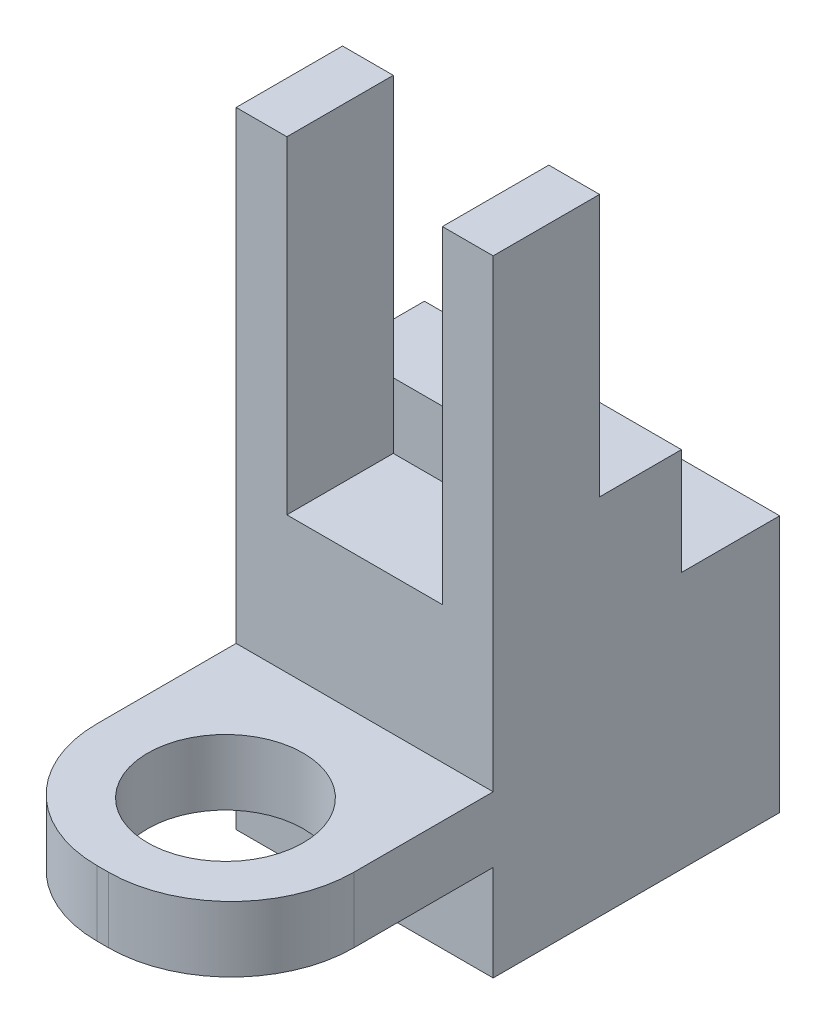
ISO-10303-21;
HEADER;
FILE_DESCRIPTION(('STEP AP214'),'2;1');
FILE_NAME('part.step','',(''),(''),'','','');
FILE_SCHEMA(('AUTOMOTIVE_DESIGN { 1 0 10303 214 1 1 1 1 }'));
ENDSEC;
DATA;
#1=APPLICATION_CONTEXT('core data for automotive mechanical design processes');
#2=APPLICATION_PROTOCOL_DEFINITION('international standard','automotive_design',2000,#1);
#3=PRODUCT_CONTEXT('',#1,'mechanical');
#4=PRODUCT('Part','Part','',(#3));
#5=PRODUCT_RELATED_PRODUCT_CATEGORY('part','',(#4));
#6=PRODUCT_DEFINITION_FORMATION('','',#4);
#7=PRODUCT_DEFINITION_CONTEXT('part definition',#1,'design');
#8=PRODUCT_DEFINITION('design','',#6,#7);
#9=PRODUCT_DEFINITION_SHAPE('','',#8);
#10=(LENGTH_UNIT() NAMED_UNIT(*) SI_UNIT(.MILLI.,.METRE.));
#11=(NAMED_UNIT(*) PLANE_ANGLE_UNIT() SI_UNIT($,.RADIAN.));
#12=(NAMED_UNIT(*) SI_UNIT($,.STERADIAN.) SOLID_ANGLE_UNIT());
#13=UNCERTAINTY_MEASURE_WITH_UNIT(LENGTH_MEASURE(1.E-05),#10,'distance_accuracy_value','');
#14=(GEOMETRIC_REPRESENTATION_CONTEXT(3) GLOBAL_UNCERTAINTY_ASSIGNED_CONTEXT((#13)) GLOBAL_UNIT_ASSIGNED_CONTEXT((#10,
#11,#12)) REPRESENTATION_CONTEXT('',''));
#15=CARTESIAN_POINT('',(0.,0.,0.));
#16=DIRECTION('',(0.,0.,1.));
#17=DIRECTION('',(1.,0.,0.));
#18=AXIS2_PLACEMENT_3D('',#15,#16,#17);
#19=CARTESIAN_POINT('',(0.,20.7,0.));
#20=DIRECTION('',(0.,-1.,0.));
#21=DIRECTION('',(0.,0.,-1.));
#22=AXIS2_PLACEMENT_3D('',#19,#20,#21);
#23=PLANE('',#22);
#24=DIRECTION('',(0.,0.,1.));
#25=VECTOR('',#24,1.);
#26=CARTESIAN_POINT('',(9.50000000000001,20.7,22.));
#27=LINE('',#26,#25);
#28=CARTESIAN_POINT('',(9.50000000000001,20.7,22.));
#29=VERTEX_POINT('',#28);
#30=CARTESIAN_POINT('',(9.50000000000001,20.7,35.));
#31=VERTEX_POINT('',#30);
#32=EDGE_CURVE('E230',#29,#31,#27,.T.);
#33=ORIENTED_EDGE('',*,*,#32,.F.);
#34=DIRECTION('',(-1.,0.,0.));
#35=VECTOR('',#34,1.);
#36=CARTESIAN_POINT('',(-15.7,20.7,22.));
#37=LINE('',#36,#35);
#38=CARTESIAN_POINT('',(-9.49999999999999,20.7,22.));
#39=VERTEX_POINT('',#38);
#40=EDGE_CURVE('E274',#29,#39,#37,.T.);
#41=ORIENTED_EDGE('',*,*,#40,.T.);
#42=DIRECTION('',(0.,0.,-1.));
#43=VECTOR('',#42,1.);
#44=CARTESIAN_POINT('',(-9.49999999999999,20.7,22.));
#45=LINE('',#44,#43);
#46=CARTESIAN_POINT('',(-9.49999999999999,20.7,35.));
#47=VERTEX_POINT('',#46);
#48=EDGE_CURVE('E240',#47,#39,#45,.T.);
#49=ORIENTED_EDGE('',*,*,#48,.F.);
#50=DIRECTION('',(-1.,0.,0.));
#51=VECTOR('',#50,1.);
#52=CARTESIAN_POINT('',(-9.49999999999999,20.7,35.));
#53=LINE('',#52,#51);
#54=EDGE_CURVE('E215',#31,#47,#53,.T.);
#55=ORIENTED_EDGE('',*,*,#54,.F.);
#56=EDGE_LOOP('',(#33,#41,#49,#55));
#57=FACE_BOUND('',#56,.T.);
#58=ADVANCED_FACE('F34',(#57),#23,.F.);
#59=CARTESIAN_POINT('',(15.7,28.7,22.));
#60=DIRECTION('',(0.,0.,-1.));
#61=DIRECTION('',(-1.,0.,0.));
#62=AXIS2_PLACEMENT_3D('',#59,#60,#61);
#63=PLANE('',#62);
#64=DIRECTION('',(0.,-1.,0.));
#65=VECTOR('',#64,1.);
#66=CARTESIAN_POINT('',(9.50000000000001,60.7,22.));
#67=LINE('',#66,#65);
#68=CARTESIAN_POINT('',(9.50000000000001,28.7,22.));
#69=VERTEX_POINT('',#68);
#70=EDGE_CURVE('E236',#69,#29,#67,.T.);
#71=ORIENTED_EDGE('',*,*,#70,.F.);
#72=DIRECTION('',(1.,0.,0.));
#73=VECTOR('',#72,1.);
#74=CARTESIAN_POINT('',(15.7,28.7,22.));
#75=LINE('',#74,#73);
#76=CARTESIAN_POINT('',(-9.49999999999999,28.7,22.));
#77=VERTEX_POINT('',#76);
#78=EDGE_CURVE('E260',#77,#69,#75,.T.);
#79=ORIENTED_EDGE('',*,*,#78,.F.);
#80=DIRECTION('',(0.,-1.,0.));
#81=VECTOR('',#80,1.);
#82=CARTESIAN_POINT('',(-9.49999999999999,60.7,22.));
#83=LINE('',#82,#81);
#84=EDGE_CURVE('E253',#77,#39,#83,.T.);
#85=ORIENTED_EDGE('',*,*,#84,.T.);
#86=ORIENTED_EDGE('',*,*,#40,.F.);
#87=EDGE_LOOP('',(#71,#79,#85,#86));
#88=FACE_BOUND('',#87,.T.);
#89=ADVANCED_FACE('F406',(#88),#63,.F.);
#90=CARTESIAN_POINT('',(-15.7,15.7,30.));
#91=DIRECTION('',(0.,-1.,0.));
#92=DIRECTION('',(0.,0.,-1.));
#93=AXIS2_PLACEMENT_3D('',#90,#91,#92);
#94=PLANE('',#93);
#95=DIRECTION('',(-1.,0.,0.));
#96=VECTOR('',#95,1.);
#97=CARTESIAN_POINT('',(-15.7,15.7,12.));
#98=LINE('',#97,#96);
#99=CARTESIAN_POINT('',(15.7,15.7,12.));
#100=VERTEX_POINT('',#99);
#101=CARTESIAN_POINT('',(-15.7,15.7,12.));
#102=VERTEX_POINT('',#101);
#103=EDGE_CURVE('E255',#100,#102,#98,.T.);
#104=ORIENTED_EDGE('',*,*,#103,.F.);
#105=DIRECTION('',(0.,0.,-1.));
#106=VECTOR('',#105,1.);
#107=CARTESIAN_POINT('',(15.7,15.7,30.));
#108=LINE('',#107,#106);
#109=CARTESIAN_POINT('',(15.7,15.7,0.));
#110=VERTEX_POINT('',#109);
#111=EDGE_CURVE('E371',#100,#110,#108,.T.);
#112=ORIENTED_EDGE('',*,*,#111,.T.);
#113=DIRECTION('',(-1.,0.,0.));
#114=VECTOR('',#113,1.);
#115=CARTESIAN_POINT('',(-15.7,15.7,0.));
#116=LINE('',#115,#114);
#117=CARTESIAN_POINT('',(-15.7,15.7,0.));
#118=VERTEX_POINT('',#117);
#119=EDGE_CURVE('E366',#110,#118,#116,.T.);
#120=ORIENTED_EDGE('',*,*,#119,.T.);
#121=DIRECTION('',(0.,0.,-1.));
#122=VECTOR('',#121,1.);
#123=CARTESIAN_POINT('',(-15.7,15.7,30.));
#124=LINE('',#123,#122);
#125=EDGE_CURVE('E369',#102,#118,#124,.T.);
#126=ORIENTED_EDGE('',*,*,#125,.F.);
#127=EDGE_LOOP('',(#104,#112,#120,#126));
#128=FACE_BOUND('',#127,.T.);
#129=ADVANCED_FACE('F385',(#128),#94,.F.);
#130=CARTESIAN_POINT('',(0.,0.,35.));
#131=DIRECTION('',(0.,0.,-1.));
#132=DIRECTION('',(-1.,0.,0.));
#133=AXIS2_PLACEMENT_3D('',#130,#131,#132);
#134=PLANE('',#133);
#135=DIRECTION('',(-1.,0.,0.));
#136=VECTOR('',#135,1.);
#137=CARTESIAN_POINT('',(-15.7,4.,35.));
#138=LINE('',#137,#136);
#139=CARTESIAN_POINT('',(15.7,4.,35.));
#140=VERTEX_POINT('',#139);
#141=CARTESIAN_POINT('',(-15.7,4.,35.));
#142=VERTEX_POINT('',#141);
#143=EDGE_CURVE('E57',#140,#142,#138,.T.);
#144=ORIENTED_EDGE('',*,*,#143,.F.);
#145=DIRECTION('',(0.,1.,0.));
#146=VECTOR('',#145,1.);
#147=CARTESIAN_POINT('',(15.7,15.7,35.));
#148=LINE('',#147,#146);
#149=CARTESIAN_POINT('',(15.7,60.7,35.));
#150=VERTEX_POINT('',#149);
#151=EDGE_CURVE('E188',#140,#150,#148,.T.);
#152=ORIENTED_EDGE('',*,*,#151,.T.);
#153=DIRECTION('',(-1.,0.,0.));
#154=VECTOR('',#153,1.);
#155=CARTESIAN_POINT('',(9.50000000000001,60.7,35.));
#156=LINE('',#155,#154);
#157=CARTESIAN_POINT('',(9.50000000000001,60.7,35.));
#158=VERTEX_POINT('',#157);
#159=EDGE_CURVE('E193',#150,#158,#156,.T.);
#160=ORIENTED_EDGE('',*,*,#159,.T.);
#161=DIRECTION('',(0.,-1.,0.));
#162=VECTOR('',#161,1.);
#163=CARTESIAN_POINT('',(9.50000000000001,20.7,35.));
#164=LINE('',#163,#162);
#165=EDGE_CURVE('E212',#158,#31,#164,.T.);
#166=ORIENTED_EDGE('',*,*,#165,.T.);
#167=ORIENTED_EDGE('',*,*,#54,.T.);
#168=DIRECTION('',(0.,1.,0.));
#169=VECTOR('',#168,1.);
#170=CARTESIAN_POINT('',(-9.49999999999999,60.7,35.));
#171=LINE('',#170,#169);
#172=CARTESIAN_POINT('',(-9.49999999999999,60.7,35.));
#173=VERTEX_POINT('',#172);
#174=EDGE_CURVE('E224',#47,#173,#171,.T.);
#175=ORIENTED_EDGE('',*,*,#174,.T.);
#176=DIRECTION('',(-1.,0.,0.));
#177=VECTOR('',#176,1.);
#178=CARTESIAN_POINT('',(-15.7,60.7,35.));
#179=LINE('',#178,#177);
#180=CARTESIAN_POINT('',(-15.7,60.7,35.));
#181=VERTEX_POINT('',#180);
#182=EDGE_CURVE('E227',#173,#181,#179,.T.);
#183=ORIENTED_EDGE('',*,*,#182,.T.);
#184=DIRECTION('',(0.,-1.,0.));
#185=VECTOR('',#184,1.);
#186=CARTESIAN_POINT('',(-15.7,-15.7,35.));
#187=LINE('',#186,#185);
#188=EDGE_CURVE('E320',#181,#142,#187,.T.);
#189=ORIENTED_EDGE('',*,*,#188,.T.);
#190=EDGE_LOOP('',(#144,#152,#160,#166,#167,#175,#183,#189));
#191=FACE_BOUND('',#190,.T.);
#192=ADVANCED_FACE('F190',(#191),#134,.F.);
#193=DIRECTION('',(1.,0.,0.));
#194=VECTOR('',#193,1.);
#195=CARTESIAN_POINT('',(15.7,-4.,35.));
#196=LINE('',#195,#194);
#197=CARTESIAN_POINT('',(-15.7,-4.,35.));
#198=VERTEX_POINT('',#197);
#199=CARTESIAN_POINT('',(15.7,-4.,35.));
#200=VERTEX_POINT('',#199);
#201=EDGE_CURVE('E298',#198,#200,#196,.T.);
#202=ORIENTED_EDGE('',*,*,#201,.F.);
#203=CARTESIAN_POINT('',(-15.7,-15.7,35.));
#204=VERTEX_POINT('',#203);
#205=EDGE_CURVE('E319',#198,#204,#187,.T.);
#206=ORIENTED_EDGE('',*,*,#205,.T.);
#207=DIRECTION('',(1.,0.,0.));
#208=VECTOR('',#207,1.);
#209=CARTESIAN_POINT('',(15.7,-15.7,35.));
#210=LINE('',#209,#208);
#211=CARTESIAN_POINT('',(15.7,-15.7,35.));
#212=VERTEX_POINT('',#211);
#213=EDGE_CURVE('E198',#204,#212,#210,.T.);
#214=ORIENTED_EDGE('',*,*,#213,.T.);
#215=EDGE_CURVE('E197',#212,#200,#148,.T.);
#216=ORIENTED_EDGE('',*,*,#215,.T.);
#217=EDGE_LOOP('',(#202,#206,#214,#216));
#218=FACE_BOUND('',#217,.T.);
#219=ADVANCED_FACE('F434',(#218),#134,.F.);
#220=CARTESIAN_POINT('',(0.,0.,0.));
#221=DIRECTION('',(0.,0.,1.));
#222=DIRECTION('',(1.,0.,0.));
#223=AXIS2_PLACEMENT_3D('',#220,#221,#222);
#224=PLANE('',#223);
#225=DIRECTION('',(0.,-1.,0.));
#226=VECTOR('',#225,1.);
#227=CARTESIAN_POINT('',(-15.7,15.7,0.));
#228=LINE('',#227,#226);
#229=CARTESIAN_POINT('',(-15.7,-15.7,0.));
#230=VERTEX_POINT('',#229);
#231=EDGE_CURVE('E358',#118,#230,#228,.T.);
#232=ORIENTED_EDGE('',*,*,#231,.F.);
#233=ORIENTED_EDGE('',*,*,#119,.F.);
#234=DIRECTION('',(0.,1.,0.));
#235=VECTOR('',#234,1.);
#236=CARTESIAN_POINT('',(15.7,15.7,0.));
#237=LINE('',#236,#235);
#238=CARTESIAN_POINT('',(15.7,-15.7,0.));
#239=VERTEX_POINT('',#238);
#240=EDGE_CURVE('E363',#239,#110,#237,.T.);
#241=ORIENTED_EDGE('',*,*,#240,.F.);
#242=DIRECTION('',(1.,0.,0.));
#243=VECTOR('',#242,1.);
#244=CARTESIAN_POINT('',(-15.7,-15.7,0.));
#245=LINE('',#244,#243);
#246=EDGE_CURVE('E361',#230,#239,#245,.T.);
#247=ORIENTED_EDGE('',*,*,#246,.F.);
#248=EDGE_LOOP('',(#232,#233,#241,#247));
#249=FACE_BOUND('',#248,.T.);
#250=DIRECTION('',(-1.,0.,0.));
#251=VECTOR('',#250,1.);
#252=CARTESIAN_POINT('',(-12.7,12.7,0.));
#253=LINE('',#252,#251);
#254=CARTESIAN_POINT('',(12.7,12.7,0.));
#255=VERTEX_POINT('',#254);
#256=CARTESIAN_POINT('',(-12.7,12.7,0.));
#257=VERTEX_POINT('',#256);
#258=EDGE_CURVE('E324',#255,#257,#253,.T.);
#259=ORIENTED_EDGE('',*,*,#258,.T.);
#260=DIRECTION('',(0.,-1.,0.));
#261=VECTOR('',#260,1.);
#262=CARTESIAN_POINT('',(-12.7,12.7,0.));
#263=LINE('',#262,#261);
#264=CARTESIAN_POINT('',(-12.7,-12.7,0.));
#265=VERTEX_POINT('',#264);
#266=EDGE_CURVE('E341',#257,#265,#263,.T.);
#267=ORIENTED_EDGE('',*,*,#266,.T.);
#268=DIRECTION('',(1.,0.,0.));
#269=VECTOR('',#268,1.);
#270=CARTESIAN_POINT('',(-12.7,-12.7,0.));
#271=LINE('',#270,#269);
#272=CARTESIAN_POINT('',(12.7,-12.7,0.));
#273=VERTEX_POINT('',#272);
#274=EDGE_CURVE('E344',#265,#273,#271,.T.);
#275=ORIENTED_EDGE('',*,*,#274,.T.);
#276=DIRECTION('',(0.,1.,0.));
#277=VECTOR('',#276,1.);
#278=CARTESIAN_POINT('',(12.7,12.7,0.));
#279=LINE('',#278,#277);
#280=EDGE_CURVE('E329',#273,#255,#279,.T.);
#281=ORIENTED_EDGE('',*,*,#280,.T.);
#282=EDGE_LOOP('',(#259,#267,#275,#281));
#283=FACE_BOUND('',#282,.T.);
#284=ADVANCED_FACE('F380',(#249,#283),#224,.F.);
#285=CARTESIAN_POINT('',(-15.7,15.7,30.));
#286=DIRECTION('',(1.,0.,0.));
#287=DIRECTION('',(0.,1.,0.));
#288=AXIS2_PLACEMENT_3D('',#285,#286,#287);
#289=PLANE('',#288);
#290=ORIENTED_EDGE('',*,*,#188,.F.);
#291=DIRECTION('',(0.,0.,1.));
#292=VECTOR('',#291,1.);
#293=CARTESIAN_POINT('',(-15.7,60.7,32.));
#294=LINE('',#293,#292);
#295=CARTESIAN_POINT('',(-15.7,60.7,22.));
#296=VERTEX_POINT('',#295);
#297=EDGE_CURVE('E241',#296,#181,#294,.T.);
#298=ORIENTED_EDGE('',*,*,#297,.F.);
#299=DIRECTION('',(0.,-1.,0.));
#300=VECTOR('',#299,1.);
#301=CARTESIAN_POINT('',(-15.7,60.7,22.));
#302=LINE('',#301,#300);
#303=CARTESIAN_POINT('',(-15.7,28.7,22.));
#304=VERTEX_POINT('',#303);
#305=EDGE_CURVE('E248',#296,#304,#302,.T.);
#306=ORIENTED_EDGE('',*,*,#305,.T.);
#307=DIRECTION('',(0.,0.,1.));
#308=VECTOR('',#307,1.);
#309=CARTESIAN_POINT('',(-15.7,28.7,22.));
#310=LINE('',#309,#308);
#311=CARTESIAN_POINT('',(-15.7,28.7,12.));
#312=VERTEX_POINT('',#311);
#313=EDGE_CURVE('E265',#312,#304,#310,.T.);
#314=ORIENTED_EDGE('',*,*,#313,.F.);
#315=DIRECTION('',(0.,-1.,0.));
#316=VECTOR('',#315,1.);
#317=CARTESIAN_POINT('',(-15.7,28.7,12.));
#318=LINE('',#317,#316);
#319=EDGE_CURVE('E268',#312,#102,#318,.T.);
#320=ORIENTED_EDGE('',*,*,#319,.T.);
#321=ORIENTED_EDGE('',*,*,#125,.T.);
#322=ORIENTED_EDGE('',*,*,#231,.T.);
#323=DIRECTION('',(0.,0.,-1.));
#324=VECTOR('',#323,1.);
#325=CARTESIAN_POINT('',(-15.7,-15.7,30.));
#326=LINE('',#325,#324);
#327=EDGE_CURVE('E11',#204,#230,#326,.T.);
#328=ORIENTED_EDGE('',*,*,#327,.F.);
#329=ORIENTED_EDGE('',*,*,#205,.F.);
#330=DIRECTION('',(0.,0.,-1.));
#331=VECTOR('',#330,1.);
#332=CARTESIAN_POINT('',(-15.7,-4.,40.));
#333=LINE('',#332,#331);
#334=CARTESIAN_POINT('',(-15.7,-4.,52.));
#335=VERTEX_POINT('',#334);
#336=EDGE_CURVE('E316',#335,#198,#333,.T.);
#337=ORIENTED_EDGE('',*,*,#336,.F.);
#338=DIRECTION('',(0.,-1.,0.));
#339=VECTOR('',#338,1.);
#340=CARTESIAN_POINT('',(-15.7,4.,52.));
#341=LINE('',#340,#339);
#342=CARTESIAN_POINT('',(-15.7,4.,52.));
#343=VERTEX_POINT('',#342);
#344=EDGE_CURVE('E295',#343,#335,#341,.T.);
#345=ORIENTED_EDGE('',*,*,#344,.F.);
#346=DIRECTION('',(0.,0.,-1.));
#347=VECTOR('',#346,1.);
#348=CARTESIAN_POINT('',(-15.7,4.,40.));
#349=LINE('',#348,#347);
#350=EDGE_CURVE('E308',#343,#142,#349,.T.);
#351=ORIENTED_EDGE('',*,*,#350,.T.);
#352=EDGE_LOOP('',(#290,#298,#306,#314,#320,#321,#322,#328,#329,#337,#345,#351));
#353=FACE_BOUND('',#352,.T.);
#354=ADVANCED_FACE('F36',(#353),#289,.F.);
#355=CARTESIAN_POINT('',(-15.7,-15.7,30.));
#356=DIRECTION('',(0.,1.,0.));
#357=DIRECTION('',(0.,0.,1.));
#358=AXIS2_PLACEMENT_3D('',#355,#356,#357);
#359=PLANE('',#358);
#360=ORIENTED_EDGE('',*,*,#246,.T.);
#361=DIRECTION('',(0.,0.,-1.));
#362=VECTOR('',#361,1.);
#363=CARTESIAN_POINT('',(15.7,-15.7,30.));
#364=LINE('',#363,#362);
#365=EDGE_CURVE('E42',#212,#239,#364,.T.);
#366=ORIENTED_EDGE('',*,*,#365,.F.);
#367=ORIENTED_EDGE('',*,*,#213,.F.);
#368=ORIENTED_EDGE('',*,*,#327,.T.);
#369=EDGE_LOOP('',(#360,#366,#367,#368));
#370=FACE_BOUND('',#369,.T.);
#371=ADVANCED_FACE('F436',(#370),#359,.F.);
#372=CARTESIAN_POINT('',(15.7,15.7,30.));
#373=DIRECTION('',(-1.,0.,0.));
#374=DIRECTION('',(0.,-1.,0.));
#375=AXIS2_PLACEMENT_3D('',#372,#373,#374);
#376=PLANE('',#375);
#377=ORIENTED_EDGE('',*,*,#111,.F.);
#378=DIRECTION('',(0.,-1.,0.));
#379=VECTOR('',#378,1.);
#380=CARTESIAN_POINT('',(15.7,28.7,12.));
#381=LINE('',#380,#379);
#382=CARTESIAN_POINT('',(15.7,28.7,12.));
#383=VERTEX_POINT('',#382);
#384=EDGE_CURVE('E272',#383,#100,#381,.T.);
#385=ORIENTED_EDGE('',*,*,#384,.F.);
#386=DIRECTION('',(0.,0.,-1.));
#387=VECTOR('',#386,1.);
#388=CARTESIAN_POINT('',(15.7,28.7,12.));
#389=LINE('',#388,#387);
#390=CARTESIAN_POINT('',(15.7,28.7,22.));
#391=VERTEX_POINT('',#390);
#392=EDGE_CURVE('E259',#391,#383,#389,.T.);
#393=ORIENTED_EDGE('',*,*,#392,.F.);
#394=DIRECTION('',(0.,-1.,0.));
#395=VECTOR('',#394,1.);
#396=CARTESIAN_POINT('',(15.7,60.7,22.));
#397=LINE('',#396,#395);
#398=CARTESIAN_POINT('',(15.7,60.7,22.));
#399=VERTEX_POINT('',#398);
#400=EDGE_CURVE('E205',#399,#391,#397,.T.);
#401=ORIENTED_EDGE('',*,*,#400,.F.);
#402=DIRECTION('',(0.,0.,-1.));
#403=VECTOR('',#402,1.);
#404=CARTESIAN_POINT('',(15.7,60.7,32.));
#405=LINE('',#404,#403);
#406=EDGE_CURVE('E201',#150,#399,#405,.T.);
#407=ORIENTED_EDGE('',*,*,#406,.F.);
#408=ORIENTED_EDGE('',*,*,#151,.F.);
#409=DIRECTION('',(0.,0.,-1.));
#410=VECTOR('',#409,1.);
#411=CARTESIAN_POINT('',(15.7,4.,40.));
#412=LINE('',#411,#410);
#413=CARTESIAN_POINT('',(15.7,4.,52.));
#414=VERTEX_POINT('',#413);
#415=EDGE_CURVE('E311',#414,#140,#412,.T.);
#416=ORIENTED_EDGE('',*,*,#415,.F.);
#417=DIRECTION('',(0.,-1.,0.));
#418=VECTOR('',#417,1.);
#419=CARTESIAN_POINT('',(15.7,4.,52.));
#420=LINE('',#419,#418);
#421=CARTESIAN_POINT('',(15.7,-4.,52.));
#422=VERTEX_POINT('',#421);
#423=EDGE_CURVE('E287',#414,#422,#420,.T.);
#424=ORIENTED_EDGE('',*,*,#423,.T.);
#425=DIRECTION('',(0.,0.,-1.));
#426=VECTOR('',#425,1.);
#427=CARTESIAN_POINT('',(15.7,-4.,40.));
#428=LINE('',#427,#426);
#429=EDGE_CURVE('E313',#422,#200,#428,.T.);
#430=ORIENTED_EDGE('',*,*,#429,.T.);
#431=ORIENTED_EDGE('',*,*,#215,.F.);
#432=ORIENTED_EDGE('',*,*,#365,.T.);
#433=ORIENTED_EDGE('',*,*,#240,.T.);
#434=EDGE_LOOP('',(#377,#385,#393,#401,#407,#408,#416,#424,#430,#431,#432,#433));
#435=FACE_BOUND('',#434,.T.);
#436=ADVANCED_FACE('F203',(#435),#376,.F.);
#437=CARTESIAN_POINT('',(-12.7,12.7,30.));
#438=DIRECTION('',(0.,-1.,0.));
#439=DIRECTION('',(0.,0.,-1.));
#440=AXIS2_PLACEMENT_3D('',#437,#438,#439);
#441=PLANE('',#440);
#442=ORIENTED_EDGE('',*,*,#258,.F.);
#443=DIRECTION('',(0.,0.,-1.));
#444=VECTOR('',#443,1.);
#445=CARTESIAN_POINT('',(12.7,12.7,30.));
#446=LINE('',#445,#444);
#447=CARTESIAN_POINT('',(12.7,12.7,30.));
#448=VERTEX_POINT('',#447);
#449=EDGE_CURVE('E338',#448,#255,#446,.T.);
#450=ORIENTED_EDGE('',*,*,#449,.F.);
#451=DIRECTION('',(-1.,0.,0.));
#452=VECTOR('',#451,1.);
#453=CARTESIAN_POINT('',(-12.7,12.7,30.));
#454=LINE('',#453,#452);
#455=CARTESIAN_POINT('',(-12.7,12.7,30.));
#456=VERTEX_POINT('',#455);
#457=EDGE_CURVE('E325',#448,#456,#454,.T.);
#458=ORIENTED_EDGE('',*,*,#457,.T.);
#459=DIRECTION('',(0.,0.,-1.));
#460=VECTOR('',#459,1.);
#461=CARTESIAN_POINT('',(-12.7,12.7,30.));
#462=LINE('',#461,#460);
#463=EDGE_CURVE('E355',#456,#257,#462,.T.);
#464=ORIENTED_EDGE('',*,*,#463,.T.);
#465=EDGE_LOOP('',(#442,#450,#458,#464));
#466=FACE_BOUND('',#465,.T.);
#467=ADVANCED_FACE('F442',(#466),#441,.T.);
#468=CARTESIAN_POINT('',(-12.7,12.7,30.));
#469=DIRECTION('',(1.,0.,0.));
#470=DIRECTION('',(0.,1.,0.));
#471=AXIS2_PLACEMENT_3D('',#468,#469,#470);
#472=PLANE('',#471);
#473=ORIENTED_EDGE('',*,*,#266,.F.);
#474=ORIENTED_EDGE('',*,*,#463,.F.);
#475=DIRECTION('',(0.,-1.,0.));
#476=VECTOR('',#475,1.);
#477=CARTESIAN_POINT('',(-12.7,12.7,30.));
#478=LINE('',#477,#476);
#479=CARTESIAN_POINT('',(-12.7,-12.7,30.));
#480=VERTEX_POINT('',#479);
#481=EDGE_CURVE('E328',#456,#480,#478,.T.);
#482=ORIENTED_EDGE('',*,*,#481,.T.);
#483=DIRECTION('',(0.,0.,-1.));
#484=VECTOR('',#483,1.);
#485=CARTESIAN_POINT('',(-12.7,-12.7,30.));
#486=LINE('',#485,#484);
#487=EDGE_CURVE('E353',#480,#265,#486,.T.);
#488=ORIENTED_EDGE('',*,*,#487,.T.);
#489=EDGE_LOOP('',(#473,#474,#482,#488));
#490=FACE_BOUND('',#489,.T.);
#491=ADVANCED_FACE('F481',(#490),#472,.T.);
#492=CARTESIAN_POINT('',(-12.7,-12.7,30.));
#493=DIRECTION('',(0.,1.,0.));
#494=DIRECTION('',(0.,0.,1.));
#495=AXIS2_PLACEMENT_3D('',#492,#493,#494);
#496=PLANE('',#495);
#497=ORIENTED_EDGE('',*,*,#274,.F.);
#498=ORIENTED_EDGE('',*,*,#487,.F.);
#499=DIRECTION('',(1.,0.,0.));
#500=VECTOR('',#499,1.);
#501=CARTESIAN_POINT('',(-12.7,-12.7,30.));
#502=LINE('',#501,#500);
#503=CARTESIAN_POINT('',(12.7,-12.7,30.));
#504=VERTEX_POINT('',#503);
#505=EDGE_CURVE('E332',#480,#504,#502,.T.);
#506=ORIENTED_EDGE('',*,*,#505,.T.);
#507=DIRECTION('',(0.,0.,-1.));
#508=VECTOR('',#507,1.);
#509=CARTESIAN_POINT('',(12.7,-12.7,30.));
#510=LINE('',#509,#508);
#511=EDGE_CURVE('E351',#504,#273,#510,.T.);
#512=ORIENTED_EDGE('',*,*,#511,.T.);
#513=EDGE_LOOP('',(#497,#498,#506,#512));
#514=FACE_BOUND('',#513,.T.);
#515=ADVANCED_FACE('F477',(#514),#496,.T.);
#516=CARTESIAN_POINT('',(12.7,12.7,30.));
#517=DIRECTION('',(-1.,0.,0.));
#518=DIRECTION('',(0.,-1.,0.));
#519=AXIS2_PLACEMENT_3D('',#516,#517,#518);
#520=PLANE('',#519);
#521=ORIENTED_EDGE('',*,*,#280,.F.);
#522=ORIENTED_EDGE('',*,*,#511,.F.);
#523=DIRECTION('',(0.,1.,0.));
#524=VECTOR('',#523,1.);
#525=CARTESIAN_POINT('',(12.7,12.7,30.));
#526=LINE('',#525,#524);
#527=EDGE_CURVE('E335',#504,#448,#526,.T.);
#528=ORIENTED_EDGE('',*,*,#527,.T.);
#529=ORIENTED_EDGE('',*,*,#449,.T.);
#530=EDGE_LOOP('',(#521,#522,#528,#529));
#531=FACE_BOUND('',#530,.T.);
#532=ADVANCED_FACE('F473',(#531),#520,.T.);
#533=CARTESIAN_POINT('',(0.,0.,30.));
#534=DIRECTION('',(0.,0.,-1.));
#535=DIRECTION('',(-1.,0.,0.));
#536=AXIS2_PLACEMENT_3D('',#533,#534,#535);
#537=PLANE('',#536);
#538=ORIENTED_EDGE('',*,*,#481,.F.);
#539=ORIENTED_EDGE('',*,*,#457,.F.);
#540=ORIENTED_EDGE('',*,*,#527,.F.);
#541=ORIENTED_EDGE('',*,*,#505,.F.);
#542=EDGE_LOOP('',(#538,#539,#540,#541));
#543=FACE_BOUND('',#542,.T.);
#544=ADVANCED_FACE('F467',(#543),#537,.T.);
#545=CARTESIAN_POINT('',(15.7,-4.,40.));
#546=DIRECTION('',(0.,1.,0.));
#547=DIRECTION('',(-1.,0.,0.));
#548=AXIS2_PLACEMENT_3D('',#545,#546,#547);
#549=PLANE('',#548);
#550=CARTESIAN_POINT('',(0.,-4.00000000000001,52.));
#551=DIRECTION('',(0.,1.,0.));
#552=DIRECTION('',(-1.,0.,0.));
#553=AXIS2_PLACEMENT_3D('',#550,#551,#552);
#554=CIRCLE('',#553,9.5);
#555=CARTESIAN_POINT('',(-9.5,-4.00000000000001,52.));
#556=VERTEX_POINT('',#555);
#557=EDGE_CURVE('E213',#556,#556,#554,.T.);
#558=ORIENTED_EDGE('',*,*,#557,.T.);
#559=EDGE_LOOP('',(#558));
#560=FACE_BOUND('',#559,.T.);
#561=ORIENTED_EDGE('',*,*,#201,.T.);
#562=ORIENTED_EDGE('',*,*,#429,.F.);
#563=CARTESIAN_POINT('',(0.699999999999999,-4.,52.));
#564=DIRECTION('',(0.,-1.,0.));
#565=DIRECTION('',(-1.,0.,0.));
#566=AXIS2_PLACEMENT_3D('',#563,#564,#565);
#567=CIRCLE('',#566,15.);
#568=CARTESIAN_POINT('',(0.699999999999999,-4.,67.));
#569=VERTEX_POINT('',#568);
#570=EDGE_CURVE('E276',#422,#569,#567,.T.);
#571=ORIENTED_EDGE('',*,*,#570,.T.);
#572=DIRECTION('',(-1.,0.,0.));
#573=VECTOR('',#572,1.);
#574=CARTESIAN_POINT('',(-0.699999999999992,-4.,67.));
#575=LINE('',#574,#573);
#576=CARTESIAN_POINT('',(-0.699999999999993,-4.,67.));
#577=VERTEX_POINT('',#576);
#578=EDGE_CURVE('E290',#569,#577,#575,.T.);
#579=ORIENTED_EDGE('',*,*,#578,.T.);
#580=CARTESIAN_POINT('',(-0.699999999999992,-4.,52.));
#581=DIRECTION('',(0.,-1.,0.));
#582=DIRECTION('',(-1.,0.,0.));
#583=AXIS2_PLACEMENT_3D('',#580,#581,#582);
#584=CIRCLE('',#583,15.);
#585=EDGE_CURVE('E281',#577,#335,#584,.T.);
#586=ORIENTED_EDGE('',*,*,#585,.T.);
#587=ORIENTED_EDGE('',*,*,#336,.T.);
#588=EDGE_LOOP('',(#561,#562,#571,#579,#586,#587));
#589=FACE_BOUND('',#588,.T.);
#590=ADVANCED_FACE('F431',(#560,#589),#549,.F.);
#591=CARTESIAN_POINT('',(-15.7,4.,40.));
#592=DIRECTION('',(0.,-1.,0.));
#593=DIRECTION('',(0.,0.,-1.));
#594=AXIS2_PLACEMENT_3D('',#591,#592,#593);
#595=PLANE('',#594);
#596=CARTESIAN_POINT('',(0.,4.,52.));
#597=DIRECTION('',(0.,-1.,0.));
#598=DIRECTION('',(0.,0.,-1.));
#599=AXIS2_PLACEMENT_3D('',#596,#597,#598);
#600=CIRCLE('',#599,9.5);
#601=CARTESIAN_POINT('',(0.,4.,42.5));
#602=VERTEX_POINT('',#601);
#603=EDGE_CURVE('E218',#602,#602,#600,.T.);
#604=ORIENTED_EDGE('',*,*,#603,.T.);
#605=EDGE_LOOP('',(#604));
#606=FACE_BOUND('',#605,.T.);
#607=ORIENTED_EDGE('',*,*,#143,.T.);
#608=ORIENTED_EDGE('',*,*,#350,.F.);
#609=CARTESIAN_POINT('',(-0.699999999999993,4.,52.));
#610=DIRECTION('',(0.,-1.,0.));
#611=DIRECTION('',(-1.,0.,0.));
#612=AXIS2_PLACEMENT_3D('',#609,#610,#611);
#613=CIRCLE('',#612,15.);
#614=CARTESIAN_POINT('',(-0.699999999999994,4.,67.));
#615=VERTEX_POINT('',#614);
#616=EDGE_CURVE('E284',#615,#343,#613,.T.);
#617=ORIENTED_EDGE('',*,*,#616,.F.);
#618=DIRECTION('',(-1.,0.,0.));
#619=VECTOR('',#618,1.);
#620=CARTESIAN_POINT('',(-0.699999999999993,4.,67.));
#621=LINE('',#620,#619);
#622=CARTESIAN_POINT('',(0.699999999999998,4.,67.));
#623=VERTEX_POINT('',#622);
#624=EDGE_CURVE('E280',#623,#615,#621,.T.);
#625=ORIENTED_EDGE('',*,*,#624,.F.);
#626=CARTESIAN_POINT('',(0.699999999999998,4.,52.));
#627=DIRECTION('',(0.,-1.,0.));
#628=DIRECTION('',(-1.,0.,0.));
#629=AXIS2_PLACEMENT_3D('',#626,#627,#628);
#630=CIRCLE('',#629,15.);
#631=EDGE_CURVE('E277',#414,#623,#630,.T.);
#632=ORIENTED_EDGE('',*,*,#631,.F.);
#633=ORIENTED_EDGE('',*,*,#415,.T.);
#634=EDGE_LOOP('',(#607,#608,#617,#625,#632,#633));
#635=FACE_BOUND('',#634,.T.);
#636=ADVANCED_FACE('F421',(#606,#635),#595,.F.);
#637=CARTESIAN_POINT('',(-0.699999999999993,4.,52.));
#638=DIRECTION('',(0.,-1.,0.));
#639=DIRECTION('',(1.,0.,0.));
#640=AXIS2_PLACEMENT_3D('',#637,#638,#639);
#641=CYLINDRICAL_SURFACE('',#640,15.);
#642=ORIENTED_EDGE('',*,*,#585,.F.);
#643=DIRECTION('',(0.,-1.,0.));
#644=VECTOR('',#643,1.);
#645=CARTESIAN_POINT('',(-0.699999999999994,4.,67.));
#646=LINE('',#645,#644);
#647=EDGE_CURVE('E299',#615,#577,#646,.T.);
#648=ORIENTED_EDGE('',*,*,#647,.F.);
#649=ORIENTED_EDGE('',*,*,#616,.T.);
#650=ORIENTED_EDGE('',*,*,#344,.T.);
#651=EDGE_LOOP('',(#642,#648,#649,#650));
#652=FACE_BOUND('',#651,.T.);
#653=ADVANCED_FACE('F452',(#652),#641,.T.);
#654=CARTESIAN_POINT('',(-0.699999999999993,4.,67.));
#655=DIRECTION('',(0.,0.,1.));
#656=DIRECTION('',(1.,0.,0.));
#657=AXIS2_PLACEMENT_3D('',#654,#655,#656);
#658=PLANE('',#657);
#659=ORIENTED_EDGE('',*,*,#578,.F.);
#660=DIRECTION('',(0.,-1.,0.));
#661=VECTOR('',#660,1.);
#662=CARTESIAN_POINT('',(0.699999999999998,4.,67.));
#663=LINE('',#662,#661);
#664=EDGE_CURVE('E301',#623,#569,#663,.T.);
#665=ORIENTED_EDGE('',*,*,#664,.F.);
#666=ORIENTED_EDGE('',*,*,#624,.T.);
#667=ORIENTED_EDGE('',*,*,#647,.T.);
#668=EDGE_LOOP('',(#659,#665,#666,#667));
#669=FACE_BOUND('',#668,.T.);
#670=ADVANCED_FACE('F455',(#669),#658,.T.);
#671=CARTESIAN_POINT('',(0.699999999999998,4.,52.));
#672=DIRECTION('',(0.,-1.,0.));
#673=DIRECTION('',(1.,0.,0.));
#674=AXIS2_PLACEMENT_3D('',#671,#672,#673);
#675=CYLINDRICAL_SURFACE('',#674,15.);
#676=ORIENTED_EDGE('',*,*,#570,.F.);
#677=ORIENTED_EDGE('',*,*,#423,.F.);
#678=ORIENTED_EDGE('',*,*,#631,.T.);
#679=ORIENTED_EDGE('',*,*,#664,.T.);
#680=EDGE_LOOP('',(#676,#677,#678,#679));
#681=FACE_BOUND('',#680,.T.);
#682=ADVANCED_FACE('F428',(#681),#675,.T.);
#683=CARTESIAN_POINT('',(-15.7,28.7,12.));
#684=DIRECTION('',(0.,0.,1.));
#685=DIRECTION('',(1.,0.,0.));
#686=AXIS2_PLACEMENT_3D('',#683,#684,#685);
#687=PLANE('',#686);
#688=ORIENTED_EDGE('',*,*,#103,.T.);
#689=ORIENTED_EDGE('',*,*,#319,.F.);
#690=DIRECTION('',(-1.,0.,0.));
#691=VECTOR('',#690,1.);
#692=CARTESIAN_POINT('',(-15.7,28.7,12.));
#693=LINE('',#692,#691);
#694=EDGE_CURVE('E263',#383,#312,#693,.T.);
#695=ORIENTED_EDGE('',*,*,#694,.F.);
#696=ORIENTED_EDGE('',*,*,#384,.T.);
#697=EDGE_LOOP('',(#688,#689,#695,#696));
#698=FACE_BOUND('',#697,.T.);
#699=ADVANCED_FACE('F390',(#698),#687,.F.);
#700=CARTESIAN_POINT('',(0.,28.7,0.));
#701=DIRECTION('',(0.,-1.,0.));
#702=DIRECTION('',(0.,0.,-1.));
#703=AXIS2_PLACEMENT_3D('',#700,#701,#702);
#704=PLANE('',#703);
#705=EDGE_CURVE('E256',#304,#77,#75,.T.);
#706=ORIENTED_EDGE('',*,*,#705,.T.);
#707=ORIENTED_EDGE('',*,*,#78,.T.);
#708=EDGE_CURVE('E261',#69,#391,#75,.T.);
#709=ORIENTED_EDGE('',*,*,#708,.T.);
#710=ORIENTED_EDGE('',*,*,#392,.T.);
#711=ORIENTED_EDGE('',*,*,#694,.T.);
#712=ORIENTED_EDGE('',*,*,#313,.T.);
#713=EDGE_LOOP('',(#706,#707,#709,#710,#711,#712));
#714=FACE_BOUND('',#713,.T.);
#715=ADVANCED_FACE('F393',(#714),#704,.F.);
#716=CARTESIAN_POINT('',(-15.7,60.7,22.));
#717=DIRECTION('',(0.,0.,1.));
#718=DIRECTION('',(1.,0.,0.));
#719=AXIS2_PLACEMENT_3D('',#716,#717,#718);
#720=PLANE('',#719);
#721=CARTESIAN_POINT('',(-9.49999999999999,60.7,22.));
#722=VERTEX_POINT('',#721);
#723=EDGE_CURVE('E49',#722,#77,#83,.T.);
#724=ORIENTED_EDGE('',*,*,#723,.T.);
#725=ORIENTED_EDGE('',*,*,#705,.F.);
#726=ORIENTED_EDGE('',*,*,#305,.F.);
#727=DIRECTION('',(-1.,0.,0.));
#728=VECTOR('',#727,1.);
#729=CARTESIAN_POINT('',(-15.7,60.7,22.));
#730=LINE('',#729,#728);
#731=EDGE_CURVE('E246',#722,#296,#730,.T.);
#732=ORIENTED_EDGE('',*,*,#731,.F.);
#733=EDGE_LOOP('',(#724,#725,#726,#732));
#734=FACE_BOUND('',#733,.T.);
#735=ADVANCED_FACE('F534',(#734),#720,.F.);
#736=CARTESIAN_POINT('',(-9.49999999999999,60.7,22.));
#737=DIRECTION('',(-1.,0.,0.));
#738=DIRECTION('',(0.,0.,1.));
#739=AXIS2_PLACEMENT_3D('',#736,#737,#738);
#740=PLANE('',#739);
#741=ORIENTED_EDGE('',*,*,#48,.T.);
#742=ORIENTED_EDGE('',*,*,#84,.F.);
#743=ORIENTED_EDGE('',*,*,#723,.F.);
#744=DIRECTION('',(0.,0.,-1.));
#745=VECTOR('',#744,1.);
#746=CARTESIAN_POINT('',(-9.49999999999999,60.7,22.));
#747=LINE('',#746,#745);
#748=EDGE_CURVE('E244',#173,#722,#747,.T.);
#749=ORIENTED_EDGE('',*,*,#748,.F.);
#750=ORIENTED_EDGE('',*,*,#174,.F.);
#751=EDGE_LOOP('',(#741,#742,#743,#749,#750));
#752=FACE_BOUND('',#751,.T.);
#753=ADVANCED_FACE('F412',(#752),#740,.F.);
#754=CARTESIAN_POINT('',(0.,60.7,0.));
#755=DIRECTION('',(0.,-1.,0.));
#756=DIRECTION('',(0.,0.,-1.));
#757=AXIS2_PLACEMENT_3D('',#754,#755,#756);
#758=PLANE('',#757);
#759=ORIENTED_EDGE('',*,*,#297,.T.);
#760=ORIENTED_EDGE('',*,*,#182,.F.);
#761=ORIENTED_EDGE('',*,*,#748,.T.);
#762=ORIENTED_EDGE('',*,*,#731,.T.);
#763=EDGE_LOOP('',(#759,#760,#761,#762));
#764=FACE_BOUND('',#763,.T.);
#765=ADVANCED_FACE('F415',(#764),#758,.F.);
#766=CARTESIAN_POINT('',(15.7,60.7,22.));
#767=DIRECTION('',(0.,0.,1.));
#768=DIRECTION('',(1.,0.,0.));
#769=AXIS2_PLACEMENT_3D('',#766,#767,#768);
#770=PLANE('',#769);
#771=ORIENTED_EDGE('',*,*,#400,.T.);
#772=ORIENTED_EDGE('',*,*,#708,.F.);
#773=CARTESIAN_POINT('',(9.50000000000001,60.7,22.));
#774=VERTEX_POINT('',#773);
#775=EDGE_CURVE('E237',#774,#69,#67,.T.);
#776=ORIENTED_EDGE('',*,*,#775,.F.);
#777=DIRECTION('',(-1.,0.,0.));
#778=VECTOR('',#777,1.);
#779=CARTESIAN_POINT('',(15.7,60.7,22.));
#780=LINE('',#779,#778);
#781=EDGE_CURVE('E231',#399,#774,#780,.T.);
#782=ORIENTED_EDGE('',*,*,#781,.F.);
#783=EDGE_LOOP('',(#771,#772,#776,#782));
#784=FACE_BOUND('',#783,.T.);
#785=ADVANCED_FACE('F399',(#784),#770,.F.);
#786=CARTESIAN_POINT('',(9.50000000000001,60.7,22.));
#787=DIRECTION('',(1.,0.,0.));
#788=DIRECTION('',(0.,0.,-1.));
#789=AXIS2_PLACEMENT_3D('',#786,#787,#788);
#790=PLANE('',#789);
#791=ORIENTED_EDGE('',*,*,#32,.T.);
#792=ORIENTED_EDGE('',*,*,#165,.F.);
#793=DIRECTION('',(0.,0.,1.));
#794=VECTOR('',#793,1.);
#795=CARTESIAN_POINT('',(9.50000000000001,60.7,22.));
#796=LINE('',#795,#794);
#797=EDGE_CURVE('E209',#774,#158,#796,.T.);
#798=ORIENTED_EDGE('',*,*,#797,.F.);
#799=ORIENTED_EDGE('',*,*,#775,.T.);
#800=ORIENTED_EDGE('',*,*,#70,.T.);
#801=EDGE_LOOP('',(#791,#792,#798,#799,#800));
#802=FACE_BOUND('',#801,.T.);
#803=ADVANCED_FACE('F402',(#802),#790,.F.);
#804=CARTESIAN_POINT('',(0.,60.7,0.));
#805=DIRECTION('',(0.,1.,0.));
#806=DIRECTION('',(0.,0.,1.));
#807=AXIS2_PLACEMENT_3D('',#804,#805,#806);
#808=PLANE('',#807);
#809=ORIENTED_EDGE('',*,*,#781,.T.);
#810=ORIENTED_EDGE('',*,*,#797,.T.);
#811=ORIENTED_EDGE('',*,*,#159,.F.);
#812=ORIENTED_EDGE('',*,*,#406,.T.);
#813=EDGE_LOOP('',(#809,#810,#811,#812));
#814=FACE_BOUND('',#813,.T.);
#815=ADVANCED_FACE('F211',(#814),#808,.T.);
#816=CARTESIAN_POINT('',(0.,12.,52.));
#817=DIRECTION('',(0.,-1.,0.));
#818=DIRECTION('',(1.,0.,0.));
#819=AXIS2_PLACEMENT_3D('',#816,#817,#818);
#820=CYLINDRICAL_SURFACE('',#819,9.5);
#821=ORIENTED_EDGE('',*,*,#603,.F.);
#822=EDGE_LOOP('',(#821));
#823=FACE_BOUND('',#822,.T.);
#824=ORIENTED_EDGE('',*,*,#557,.F.);
#825=EDGE_LOOP('',(#824));
#826=FACE_BOUND('',#825,.T.);
#827=ADVANCED_FACE('F564',(#823,#826),#820,.F.);
#828=CLOSED_SHELL('',(#58,#89,#129,#192,#219,#284,#354,#371,#436,#467,#491,#515,#532,#544,#590,
#636,#653,#670,#682,#699,#715,#735,#753,#765,#785,#803,#815,#827));
#829=MANIFOLD_SOLID_BREP('B2',#828);
#830=ADVANCED_BREP_SHAPE_REPRESENTATION('',(#18,#829),#14);
#831=SHAPE_DEFINITION_REPRESENTATION(#9,#830);
ENDSEC;
END-ISO-10303-21;
